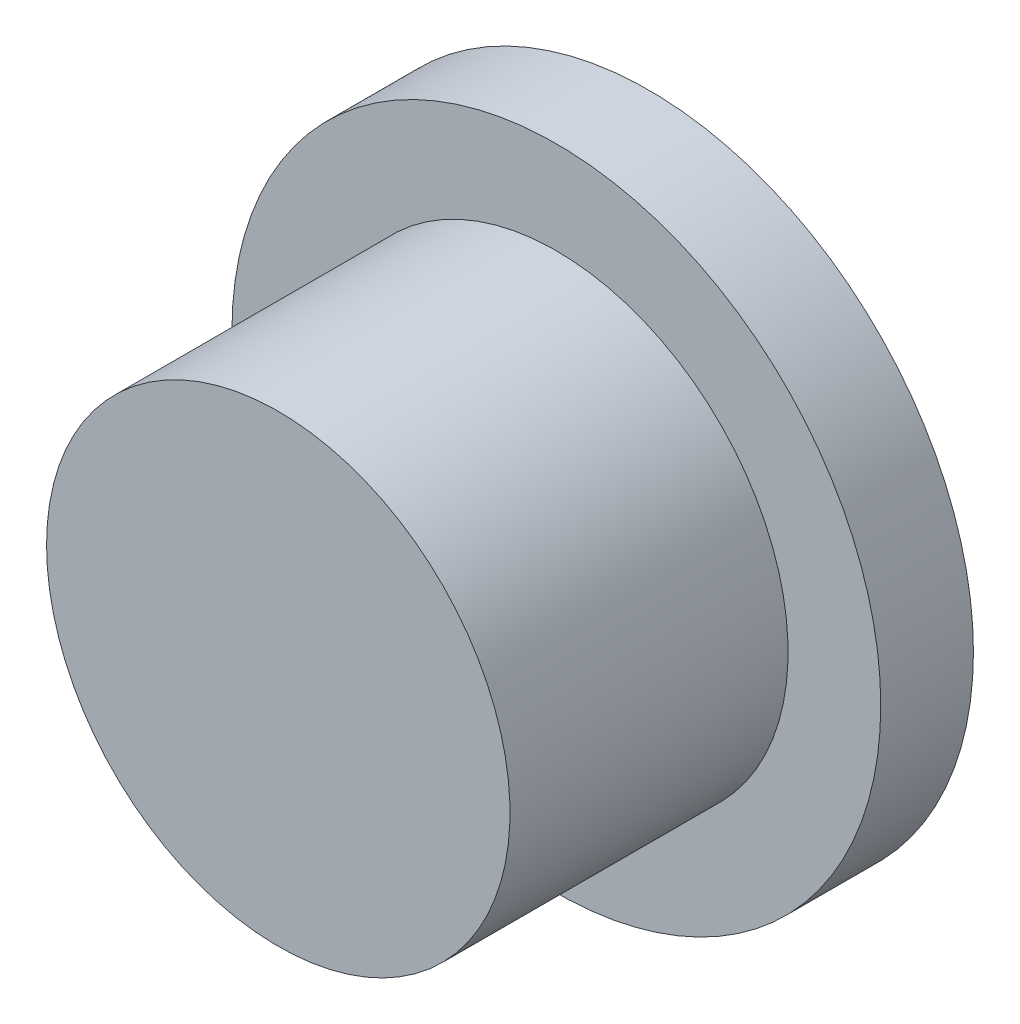
ISO-10303-21;
HEADER;
FILE_DESCRIPTION(('STEP AP214'),'2;1');
FILE_NAME('part.step','',(''),(''),'','','');
FILE_SCHEMA(('AUTOMOTIVE_DESIGN { 1 0 10303 214 1 1 1 1 }'));
ENDSEC;
DATA;
#1=APPLICATION_CONTEXT('core data for automotive mechanical design processes');
#2=APPLICATION_PROTOCOL_DEFINITION('international standard','automotive_design',2000,#1);
#3=PRODUCT_CONTEXT('',#1,'mechanical');
#4=PRODUCT('Part','Part','',(#3));
#5=PRODUCT_RELATED_PRODUCT_CATEGORY('part','',(#4));
#6=PRODUCT_DEFINITION_FORMATION('','',#4);
#7=PRODUCT_DEFINITION_CONTEXT('part definition',#1,'design');
#8=PRODUCT_DEFINITION('design','',#6,#7);
#9=PRODUCT_DEFINITION_SHAPE('','',#8);
#10=(LENGTH_UNIT() NAMED_UNIT(*) SI_UNIT(.MILLI.,.METRE.));
#11=(NAMED_UNIT(*) PLANE_ANGLE_UNIT() SI_UNIT($,.RADIAN.));
#12=(NAMED_UNIT(*) SI_UNIT($,.STERADIAN.) SOLID_ANGLE_UNIT());
#13=UNCERTAINTY_MEASURE_WITH_UNIT(LENGTH_MEASURE(1.E-05),#10,'distance_accuracy_value','');
#14=(GEOMETRIC_REPRESENTATION_CONTEXT(3) GLOBAL_UNCERTAINTY_ASSIGNED_CONTEXT((#13)) GLOBAL_UNIT_ASSIGNED_CONTEXT((#10,
#11,#12)) REPRESENTATION_CONTEXT('',''));
#15=CARTESIAN_POINT('',(0.,0.,0.));
#16=DIRECTION('',(0.,0.,1.));
#17=DIRECTION('',(1.,0.,0.));
#18=AXIS2_PLACEMENT_3D('',#15,#16,#17);
#19=CARTESIAN_POINT('',(0.,0.,2.54));
#20=DIRECTION('',(0.,0.,-1.));
#21=DIRECTION('',(-1.,0.,0.));
#22=AXIS2_PLACEMENT_3D('',#19,#20,#21);
#23=CYLINDRICAL_SURFACE('',#22,8.89);
#24=CARTESIAN_POINT('',(0.,0.,2.54));
#25=DIRECTION('',(0.,0.,1.));
#26=DIRECTION('',(1.,0.,0.));
#27=AXIS2_PLACEMENT_3D('',#24,#25,#26);
#28=CIRCLE('',#27,8.89);
#29=CARTESIAN_POINT('',(8.89,0.,2.54));
#30=VERTEX_POINT('',#29);
#31=EDGE_CURVE('E51',#30,#30,#28,.T.);
#32=ORIENTED_EDGE('',*,*,#31,.F.);
#33=EDGE_LOOP('',(#32));
#34=FACE_BOUND('',#33,.T.);
#35=CARTESIAN_POINT('',(0.,0.,0.));
#36=DIRECTION('',(0.,0.,1.));
#37=DIRECTION('',(1.,0.,0.));
#38=AXIS2_PLACEMENT_3D('',#35,#36,#37);
#39=CIRCLE('',#38,8.89);
#40=CARTESIAN_POINT('',(8.89,0.,0.));
#41=VERTEX_POINT('',#40);
#42=EDGE_CURVE('E46',#41,#41,#39,.T.);
#43=ORIENTED_EDGE('',*,*,#42,.T.);
#44=EDGE_LOOP('',(#43));
#45=FACE_BOUND('',#44,.T.);
#46=ADVANCED_FACE('F43',(#34,#45),#23,.T.);
#47=CARTESIAN_POINT('',(0.,0.,2.54));
#48=DIRECTION('',(0.,0.,1.));
#49=DIRECTION('',(1.,0.,0.));
#50=AXIS2_PLACEMENT_3D('',#47,#48,#49);
#51=PLANE('',#50);
#52=CARTESIAN_POINT('',(0.,0.,2.54));
#53=DIRECTION('',(0.,0.,1.));
#54=DIRECTION('',(1.,0.,0.));
#55=AXIS2_PLACEMENT_3D('',#52,#53,#54);
#56=CIRCLE('',#55,6.35);
#57=CARTESIAN_POINT('',(-6.35,0.,2.54));
#58=VERTEX_POINT('',#57);
#59=EDGE_CURVE('E10',#58,#58,#56,.T.);
#60=ORIENTED_EDGE('',*,*,#59,.F.);
#61=EDGE_LOOP('',(#60));
#62=FACE_BOUND('',#61,.T.);
#63=ORIENTED_EDGE('',*,*,#31,.T.);
#64=EDGE_LOOP('',(#63));
#65=FACE_BOUND('',#64,.T.);
#66=ADVANCED_FACE('F71',(#62,#65),#51,.T.);
#67=CARTESIAN_POINT('',(0.,0.,0.));
#68=DIRECTION('',(0.,0.,1.));
#69=DIRECTION('',(1.,0.,0.));
#70=AXIS2_PLACEMENT_3D('',#67,#68,#69);
#71=PLANE('',#70);
#72=ORIENTED_EDGE('',*,*,#42,.F.);
#73=EDGE_LOOP('',(#72));
#74=FACE_BOUND('',#73,.T.);
#75=ADVANCED_FACE('F68',(#74),#71,.F.);
#76=CARTESIAN_POINT('',(0.,0.,10.16));
#77=DIRECTION('',(0.,0.,-1.));
#78=DIRECTION('',(-1.,0.,0.));
#79=AXIS2_PLACEMENT_3D('',#76,#77,#78);
#80=CYLINDRICAL_SURFACE('',#79,6.35);
#81=CARTESIAN_POINT('',(0.,0.,10.16));
#82=DIRECTION('',(0.,0.,1.));
#83=DIRECTION('',(1.,0.,0.));
#84=AXIS2_PLACEMENT_3D('',#81,#82,#83);
#85=CIRCLE('',#84,6.35);
#86=CARTESIAN_POINT('',(-6.35,0.,10.16));
#87=VERTEX_POINT('',#86);
#88=EDGE_CURVE('E58',#87,#87,#85,.T.);
#89=CARTESIAN_POINT('',(-6.35,0.,10.16));
#90=CARTESIAN_POINT('',(-6.35,0.,10.080625));
#91=CARTESIAN_POINT('',(-6.35,0.,10.00125));
#92=CARTESIAN_POINT('',(-6.35,0.,9.8425));
#93=CARTESIAN_POINT('',(-6.35,0.,9.763125));
#94=CARTESIAN_POINT('',(-6.35,0.,9.604375));
#95=CARTESIAN_POINT('',(-6.35,0.,9.525));
#96=CARTESIAN_POINT('',(-6.35,0.,9.36625));
#97=CARTESIAN_POINT('',(-6.35,0.,9.286875));
#98=CARTESIAN_POINT('',(-6.35,0.,9.128125));
#99=CARTESIAN_POINT('',(-6.35,0.,9.04875));
#100=CARTESIAN_POINT('',(-6.35,0.,8.89));
#101=CARTESIAN_POINT('',(-6.35,0.,8.810625));
#102=CARTESIAN_POINT('',(-6.35,0.,8.651875));
#103=CARTESIAN_POINT('',(-6.35,0.,8.5725));
#104=CARTESIAN_POINT('',(-6.35,0.,8.41375));
#105=CARTESIAN_POINT('',(-6.35,0.,8.334375));
#106=CARTESIAN_POINT('',(-6.35,0.,8.175625));
#107=CARTESIAN_POINT('',(-6.35,0.,8.09625));
#108=CARTESIAN_POINT('',(-6.35,0.,7.9375));
#109=CARTESIAN_POINT('',(-6.35,0.,7.858125));
#110=CARTESIAN_POINT('',(-6.35,0.,7.699375));
#111=CARTESIAN_POINT('',(-6.35,0.,7.62));
#112=CARTESIAN_POINT('',(-6.35,0.,7.46125));
#113=CARTESIAN_POINT('',(-6.35,0.,7.381875));
#114=CARTESIAN_POINT('',(-6.35,0.,7.223125));
#115=CARTESIAN_POINT('',(-6.35,0.,7.14375));
#116=CARTESIAN_POINT('',(-6.35,0.,6.985));
#117=CARTESIAN_POINT('',(-6.35,0.,6.905625));
#118=CARTESIAN_POINT('',(-6.35,0.,6.746875));
#119=CARTESIAN_POINT('',(-6.35,0.,6.6675));
#120=CARTESIAN_POINT('',(-6.35,0.,6.50875));
#121=CARTESIAN_POINT('',(-6.35,0.,6.429375));
#122=CARTESIAN_POINT('',(-6.35,0.,6.270625));
#123=CARTESIAN_POINT('',(-6.35,0.,6.19125));
#124=CARTESIAN_POINT('',(-6.35,0.,6.0325));
#125=CARTESIAN_POINT('',(-6.35,0.,5.953125));
#126=CARTESIAN_POINT('',(-6.35,0.,5.794375));
#127=CARTESIAN_POINT('',(-6.35,0.,5.715));
#128=CARTESIAN_POINT('',(-6.35,0.,5.55625));
#129=CARTESIAN_POINT('',(-6.35,0.,5.476875));
#130=CARTESIAN_POINT('',(-6.35,0.,5.318125));
#131=CARTESIAN_POINT('',(-6.35,0.,5.23875));
#132=CARTESIAN_POINT('',(-6.35,0.,5.08));
#133=CARTESIAN_POINT('',(-6.35,0.,5.000625));
#134=CARTESIAN_POINT('',(-6.35,0.,4.841875));
#135=CARTESIAN_POINT('',(-6.35,0.,4.7625));
#136=CARTESIAN_POINT('',(-6.35,0.,4.60375));
#137=CARTESIAN_POINT('',(-6.35,0.,4.524375));
#138=CARTESIAN_POINT('',(-6.35,0.,4.365625));
#139=CARTESIAN_POINT('',(-6.35,0.,4.28625));
#140=CARTESIAN_POINT('',(-6.35,0.,4.1275));
#141=CARTESIAN_POINT('',(-6.35,0.,4.048125));
#142=CARTESIAN_POINT('',(-6.35,0.,3.889375));
#143=CARTESIAN_POINT('',(-6.35,0.,3.81));
#144=CARTESIAN_POINT('',(-6.35,0.,3.65125));
#145=CARTESIAN_POINT('',(-6.35,0.,3.571875));
#146=CARTESIAN_POINT('',(-6.35,0.,3.413125));
#147=CARTESIAN_POINT('',(-6.35,0.,3.33375));
#148=CARTESIAN_POINT('',(-6.35,0.,3.175));
#149=CARTESIAN_POINT('',(-6.35,0.,3.095625));
#150=CARTESIAN_POINT('',(-6.35,0.,2.936875));
#151=CARTESIAN_POINT('',(-6.35,0.,2.8575));
#152=CARTESIAN_POINT('',(-6.35,0.,2.69875));
#153=CARTESIAN_POINT('',(-6.35,0.,2.619375));
#154=CARTESIAN_POINT('',(-6.35,0.,2.54));
#155=B_SPLINE_CURVE_WITH_KNOTS('',3,(#89,#90,#91,#92,#93,#94,#95,#96,#97,#98,#99,#100,#101,#102,
#103,#104,#105,#106,#107,#108,#109,#110,#111,#112,#113,#114,#115,#116,#117,#118,#119,#120,#121,
#122,#123,#124,#125,#126,#127,#128,#129,#130,#131,#132,#133,#134,#135,#136,#137,#138,#139,#140,
#141,#142,#143,#144,#145,#146,#147,#148,#149,#150,#151,#152,#153,#154),.UNSPECIFIED.,.F.,.F.,(4,
2,2,2,2,2,2,2,2,2,2,2,2,2,2,2,2,2,2,2,2,2,2,2,2,2,2,2,2,2,2,2,4),(0.,0.238124999999999,
0.476249999999999,0.714375,0.952499999999998,1.190625,1.42875,1.666875,1.905,2.143125,2.38125,
2.619375,2.8575,3.095625,3.33375,3.571875,3.81,4.048125,4.28625,4.524375,4.7625,5.000625,
5.23875,5.476875,5.715,5.953125,6.19125,6.429375,6.6675,6.905625,7.14375,7.381875,7.62),.UNSPECIFIED.);
#156=EDGE_CURVE('BSEAM70',#87,#58,#155,.T.);
#157=ORIENTED_EDGE('',*,*,#88,.F.);
#158=ORIENTED_EDGE('',*,*,#59,.T.);
#159=ORIENTED_EDGE('',*,*,#156,.T.);
#160=ORIENTED_EDGE('',*,*,#156,.F.);
#161=EDGE_LOOP('',(#157,#159,#158,#160));
#162=FACE_BOUND('',#161,.T.);
#163=ADVANCED_FACE('F70',(#162),#80,.T.);
#164=CARTESIAN_POINT('',(0.,0.,10.16));
#165=DIRECTION('',(0.,0.,1.));
#166=DIRECTION('',(1.,0.,0.));
#167=AXIS2_PLACEMENT_3D('',#164,#165,#166);
#168=PLANE('',#167);
#169=ORIENTED_EDGE('',*,*,#88,.T.);
#170=EDGE_LOOP('',(#169));
#171=FACE_BOUND('',#170,.T.);
#172=ADVANCED_FACE('F77',(#171),#168,.T.);
#173=CLOSED_SHELL('',(#46,#66,#75,#163,#172));
#174=MANIFOLD_SOLID_BREP('B2',#173);
#175=ADVANCED_BREP_SHAPE_REPRESENTATION('',(#18,#174),#14);
#176=SHAPE_DEFINITION_REPRESENTATION(#9,#175);
ENDSEC;
END-ISO-10303-21;
